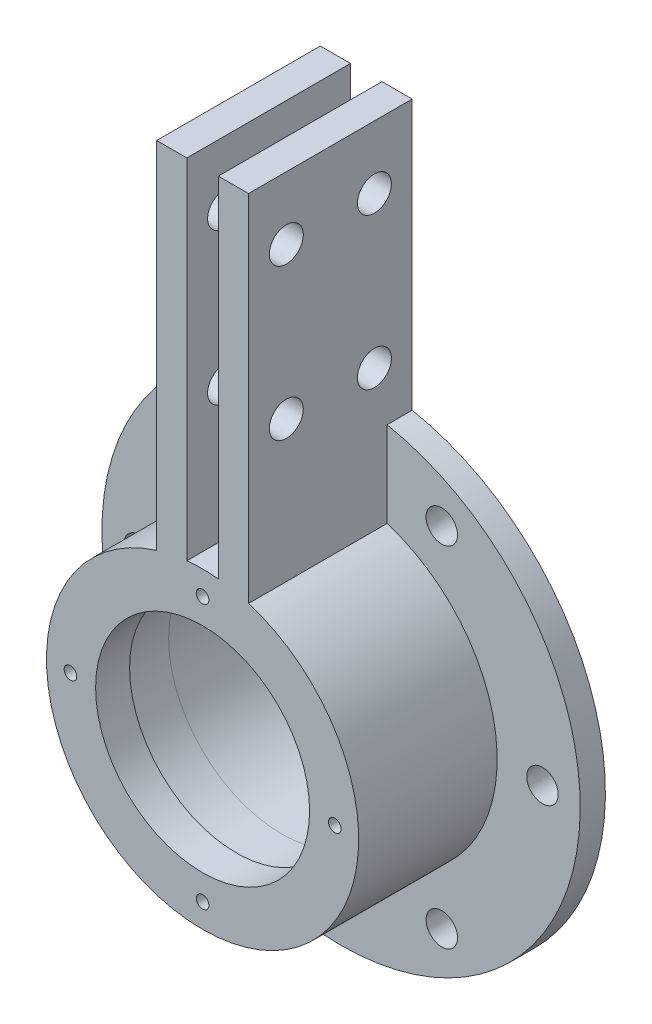
ISO-10303-21;
HEADER;
FILE_DESCRIPTION(('STEP AP214'),'2;1');
FILE_NAME('part.step','',(''),(''),'','','');
FILE_SCHEMA(('AUTOMOTIVE_DESIGN { 1 0 10303 214 1 1 1 1 }'));
ENDSEC;
DATA;
#1=APPLICATION_CONTEXT('core data for automotive mechanical design processes');
#2=APPLICATION_PROTOCOL_DEFINITION('international standard','automotive_design',2000,#1);
#3=PRODUCT_CONTEXT('',#1,'mechanical');
#4=PRODUCT('Part','Part','',(#3));
#5=PRODUCT_RELATED_PRODUCT_CATEGORY('part','',(#4));
#6=PRODUCT_DEFINITION_FORMATION('','',#4);
#7=PRODUCT_DEFINITION_CONTEXT('part definition',#1,'design');
#8=PRODUCT_DEFINITION('design','',#6,#7);
#9=PRODUCT_DEFINITION_SHAPE('','',#8);
#10=(LENGTH_UNIT() NAMED_UNIT(*) SI_UNIT(.MILLI.,.METRE.));
#11=(NAMED_UNIT(*) PLANE_ANGLE_UNIT() SI_UNIT($,.RADIAN.));
#12=(NAMED_UNIT(*) SI_UNIT($,.STERADIAN.) SOLID_ANGLE_UNIT());
#13=UNCERTAINTY_MEASURE_WITH_UNIT(LENGTH_MEASURE(1.E-05),#10,'distance_accuracy_value','');
#14=(GEOMETRIC_REPRESENTATION_CONTEXT(3) GLOBAL_UNCERTAINTY_ASSIGNED_CONTEXT((#13)) GLOBAL_UNIT_ASSIGNED_CONTEXT((#10,
#11,#12)) REPRESENTATION_CONTEXT('',''));
#15=CARTESIAN_POINT('',(0.,0.,0.));
#16=DIRECTION('',(0.,0.,1.));
#17=DIRECTION('',(1.,0.,0.));
#18=AXIS2_PLACEMENT_3D('',#15,#16,#17);
#19=CARTESIAN_POINT('',(0.,0.,0.));
#20=DIRECTION('',(0.,0.,1.));
#21=DIRECTION('',(1.,0.,0.));
#22=AXIS2_PLACEMENT_3D('',#19,#20,#21);
#23=PLANE('',#22);
#24=CARTESIAN_POINT('',(39.9999999999998,69.2820323027552,0.));
#25=DIRECTION('',(0.,0.,-1.));
#26=DIRECTION('',(-1.,0.,0.));
#27=AXIS2_PLACEMENT_3D('',#24,#25,#26);
#28=CIRCLE('',#27,6.24999999999999);
#29=CARTESIAN_POINT('',(33.7499999999999,69.2820323027552,0.));
#30=VERTEX_POINT('',#29);
#31=EDGE_CURVE('E185',#30,#30,#28,.T.);
#32=ORIENTED_EDGE('',*,*,#31,.F.);
#33=EDGE_LOOP('',(#32));
#34=FACE_BOUND('',#33,.T.);
#35=CARTESIAN_POINT('',(-39.9999999999994,-69.2820323027554,0.));
#36=DIRECTION('',(0.,0.,-1.));
#37=DIRECTION('',(-1.,0.,0.));
#38=AXIS2_PLACEMENT_3D('',#35,#36,#37);
#39=CIRCLE('',#38,6.24999999999999);
#40=CARTESIAN_POINT('',(-46.2499999999993,-69.2820323027554,0.));
#41=VERTEX_POINT('',#40);
#42=EDGE_CURVE('E209',#41,#41,#39,.T.);
#43=ORIENTED_EDGE('',*,*,#42,.F.);
#44=EDGE_LOOP('',(#43));
#45=FACE_BOUND('',#44,.T.);
#46=DIRECTION('',(-1.,0.,0.));
#47=VECTOR('',#46,1.);
#48=CARTESIAN_POINT('',(-18.25,200.253164472457,0.));
#49=LINE('',#48,#47);
#50=CARTESIAN_POINT('',(-6.25,200.253164472457,0.));
#51=VERTEX_POINT('',#50);
#52=CARTESIAN_POINT('',(-18.25,200.253164472457,0.));
#53=VERTEX_POINT('',#52);
#54=EDGE_CURVE('E297',#51,#53,#49,.T.);
#55=ORIENTED_EDGE('',*,*,#54,.F.);
#56=DIRECTION('',(0.,1.,0.));
#57=VECTOR('',#56,1.);
#58=CARTESIAN_POINT('',(-6.25,200.253164472457,0.));
#59=LINE('',#58,#57);
#60=CARTESIAN_POINT('',(-6.24999999999999,61.6841754423288,0.));
#61=VERTEX_POINT('',#60);
#62=EDGE_CURVE('E267',#61,#51,#59,.T.);
#63=ORIENTED_EDGE('',*,*,#62,.F.);
#64=CARTESIAN_POINT('',(0.,0.,0.));
#65=DIRECTION('',(0.,0.,1.));
#66=DIRECTION('',(1.,0.,0.));
#67=AXIS2_PLACEMENT_3D('',#64,#65,#66);
#68=CIRCLE('',#67,62.);
#69=CARTESIAN_POINT('',(6.25000000000002,61.6841754423288,0.));
#70=VERTEX_POINT('',#69);
#71=EDGE_CURVE('E273',#70,#61,#68,.T.);
#72=ORIENTED_EDGE('',*,*,#71,.F.);
#73=DIRECTION('',(0.,-1.,0.));
#74=VECTOR('',#73,1.);
#75=CARTESIAN_POINT('',(6.25,200.253164472457,0.));
#76=LINE('',#75,#74);
#77=CARTESIAN_POINT('',(6.25,200.253164472457,0.));
#78=VERTEX_POINT('',#77);
#79=EDGE_CURVE('E308',#78,#70,#76,.T.);
#80=ORIENTED_EDGE('',*,*,#79,.F.);
#81=DIRECTION('',(-1.,0.,0.));
#82=VECTOR('',#81,1.);
#83=CARTESIAN_POINT('',(6.25,200.253164472457,0.));
#84=LINE('',#83,#82);
#85=CARTESIAN_POINT('',(18.25,200.253164472457,0.));
#86=VERTEX_POINT('',#85);
#87=EDGE_CURVE('E305',#86,#78,#84,.T.);
#88=ORIENTED_EDGE('',*,*,#87,.F.);
#89=DIRECTION('',(0.,1.,0.));
#90=VECTOR('',#89,1.);
#91=CARTESIAN_POINT('',(18.25,59.2531644724567,0.));
#92=LINE('',#91,#90);
#93=CARTESIAN_POINT('',(18.25,93.2305609765382,0.));
#94=VERTEX_POINT('',#93);
#95=EDGE_CURVE('E302',#94,#86,#92,.T.);
#96=ORIENTED_EDGE('',*,*,#95,.F.);
#97=CARTESIAN_POINT('',(0.,0.,0.));
#98=DIRECTION('',(0.,0.,-1.));
#99=DIRECTION('',(-1.,0.,0.));
#100=AXIS2_PLACEMENT_3D('',#97,#98,#99);
#101=CIRCLE('',#100,95.);
#102=CARTESIAN_POINT('',(-18.25,93.2305609765382,0.));
#103=VERTEX_POINT('',#102);
#104=EDGE_CURVE('E238',#94,#103,#101,.T.);
#105=ORIENTED_EDGE('',*,*,#104,.T.);
#106=DIRECTION('',(0.,-1.,0.));
#107=VECTOR('',#106,1.);
#108=CARTESIAN_POINT('',(-18.25,59.2531644724567,0.));
#109=LINE('',#108,#107);
#110=EDGE_CURVE('E68',#53,#103,#109,.T.);
#111=ORIENTED_EDGE('',*,*,#110,.F.);
#112=EDGE_LOOP('',(#55,#63,#72,#80,#88,#96,#105,#111));
#113=FACE_BOUND('',#112,.T.);
#114=CARTESIAN_POINT('',(40.0000000000008,-69.2820323027546,0.));
#115=DIRECTION('',(0.,0.,-1.));
#116=DIRECTION('',(-1.,0.,0.));
#117=AXIS2_PLACEMENT_3D('',#114,#115,#116);
#118=CIRCLE('',#117,6.24999999999998);
#119=CARTESIAN_POINT('',(33.7500000000008,-69.2820323027546,0.));
#120=VERTEX_POINT('',#119);
#121=EDGE_CURVE('E217',#120,#120,#118,.T.);
#122=ORIENTED_EDGE('',*,*,#121,.F.);
#123=EDGE_LOOP('',(#122));
#124=FACE_BOUND('',#123,.T.);
#125=CARTESIAN_POINT('',(-80.,-5.58637014214901E-13,0.));
#126=DIRECTION('',(0.,0.,-1.));
#127=DIRECTION('',(-1.,0.,0.));
#128=AXIS2_PLACEMENT_3D('',#125,#126,#127);
#129=CIRCLE('',#128,6.24999999999999);
#130=CARTESIAN_POINT('',(-86.25,-5.58637014214901E-13,0.));
#131=VERTEX_POINT('',#130);
#132=EDGE_CURVE('E201',#131,#131,#129,.T.);
#133=ORIENTED_EDGE('',*,*,#132,.F.);
#134=EDGE_LOOP('',(#133));
#135=FACE_BOUND('',#134,.T.);
#136=CARTESIAN_POINT('',(-40.0000000000003,69.2820323027549,0.));
#137=DIRECTION('',(0.,0.,-1.));
#138=DIRECTION('',(-1.,0.,0.));
#139=AXIS2_PLACEMENT_3D('',#136,#137,#138);
#140=CIRCLE('',#139,6.24999999999998);
#141=CARTESIAN_POINT('',(-46.2500000000003,69.2820323027549,0.));
#142=VERTEX_POINT('',#141);
#143=EDGE_CURVE('E193',#142,#142,#140,.T.);
#144=ORIENTED_EDGE('',*,*,#143,.F.);
#145=EDGE_LOOP('',(#144));
#146=FACE_BOUND('',#145,.T.);
#147=CARTESIAN_POINT('',(80.,0.,0.));
#148=DIRECTION('',(0.,0.,-1.));
#149=DIRECTION('',(-1.,0.,0.));
#150=AXIS2_PLACEMENT_3D('',#147,#148,#149);
#151=CIRCLE('',#150,6.24999999999999);
#152=CARTESIAN_POINT('',(73.75,0.,0.));
#153=VERTEX_POINT('',#152);
#154=EDGE_CURVE('E177',#153,#153,#151,.T.);
#155=ORIENTED_EDGE('',*,*,#154,.F.);
#156=EDGE_LOOP('',(#155));
#157=FACE_BOUND('',#156,.T.);
#158=CARTESIAN_POINT('',(0.,0.,0.));
#159=DIRECTION('',(0.,0.,1.));
#160=DIRECTION('',(1.,0.,0.));
#161=AXIS2_PLACEMENT_3D('',#158,#159,#160);
#162=CIRCLE('',#161,52.5);
#163=CARTESIAN_POINT('',(52.5,0.,0.));
#164=VERTEX_POINT('',#163);
#165=EDGE_CURVE('E11',#164,#164,#162,.F.);
#166=ORIENTED_EDGE('',*,*,#165,.F.);
#167=EDGE_LOOP('',(#166));
#168=FACE_BOUND('',#167,.T.);
#169=ADVANCED_FACE('F45',(#34,#45,#113,#124,#135,#146,#157,#168),#23,.F.);
#170=CARTESIAN_POINT('',(0.,0.,65.));
#171=DIRECTION('',(0.,0.,-1.));
#172=DIRECTION('',(-1.,0.,0.));
#173=AXIS2_PLACEMENT_3D('',#170,#171,#172);
#174=CYLINDRICAL_SURFACE('',#173,42.5);
#175=CARTESIAN_POINT('',(0.,0.,65.));
#176=DIRECTION('',(0.,0.,1.));
#177=DIRECTION('',(1.,0.,0.));
#178=AXIS2_PLACEMENT_3D('',#175,#176,#177);
#179=CIRCLE('',#178,42.5);
#180=CARTESIAN_POINT('',(42.5,0.,65.));
#181=VERTEX_POINT('',#180);
#182=EDGE_CURVE('E263',#181,#181,#179,.T.);
#183=ORIENTED_EDGE('',*,*,#182,.T.);
#184=EDGE_LOOP('',(#183));
#185=FACE_BOUND('',#184,.T.);
#186=CARTESIAN_POINT('',(0.,0.,51.5));
#187=DIRECTION('',(0.,0.,-1.));
#188=DIRECTION('',(-1.,0.,0.));
#189=AXIS2_PLACEMENT_3D('',#186,#187,#188);
#190=CIRCLE('',#189,42.5);
#191=CARTESIAN_POINT('',(-42.5,0.,51.5));
#192=VERTEX_POINT('',#191);
#193=EDGE_CURVE('E230',#192,#192,#190,.T.);
#194=ORIENTED_EDGE('',*,*,#193,.T.);
#195=EDGE_LOOP('',(#194));
#196=FACE_BOUND('',#195,.T.);
#197=ADVANCED_FACE('F420',(#185,#196),#174,.F.);
#198=CARTESIAN_POINT('',(0.,0.,65.));
#199=DIRECTION('',(0.,0.,-1.));
#200=DIRECTION('',(-1.,0.,0.));
#201=AXIS2_PLACEMENT_3D('',#198,#199,#200);
#202=CYLINDRICAL_SURFACE('',#201,62.);
#203=CARTESIAN_POINT('',(0.,0.,10.));
#204=DIRECTION('',(0.,0.,-1.));
#205=DIRECTION('',(-1.,0.,0.));
#206=AXIS2_PLACEMENT_3D('',#203,#204,#205);
#207=CIRCLE('',#206,62.);
#208=CARTESIAN_POINT('',(18.25,59.2531644724567,10.));
#209=VERTEX_POINT('',#208);
#210=CARTESIAN_POINT('',(-18.25,59.2531644724567,10.));
#211=VERTEX_POINT('',#210);
#212=EDGE_CURVE('E250',#209,#211,#207,.T.);
#213=ORIENTED_EDGE('',*,*,#212,.F.);
#214=DIRECTION('',(0.,0.,-1.));
#215=VECTOR('',#214,1.);
#216=CARTESIAN_POINT('',(18.25,59.2531644724567,65.));
#217=LINE('',#216,#215);
#218=CARTESIAN_POINT('',(18.25,59.2531644724567,65.));
#219=VERTEX_POINT('',#218);
#220=EDGE_CURVE('E328',#219,#209,#217,.T.);
#221=ORIENTED_EDGE('',*,*,#220,.F.);
#222=CARTESIAN_POINT('',(0.,0.,65.));
#223=DIRECTION('',(0.,0.,1.));
#224=DIRECTION('',(1.,0.,0.));
#225=AXIS2_PLACEMENT_3D('',#222,#223,#224);
#226=CIRCLE('',#225,62.);
#227=CARTESIAN_POINT('',(-18.25,59.2531644724567,65.));
#228=VERTEX_POINT('',#227);
#229=EDGE_CURVE('E279',#228,#219,#226,.T.);
#230=ORIENTED_EDGE('',*,*,#229,.F.);
#231=DIRECTION('',(0.,0.,-1.));
#232=VECTOR('',#231,1.);
#233=CARTESIAN_POINT('',(-18.25,59.2531644724567,65.));
#234=LINE('',#233,#232);
#235=EDGE_CURVE('E332',#228,#211,#234,.T.);
#236=ORIENTED_EDGE('',*,*,#235,.T.);
#237=EDGE_LOOP('',(#213,#221,#230,#236));
#238=FACE_BOUND('',#237,.T.);
#239=ADVANCED_FACE('F426',(#238),#202,.T.);
#240=CARTESIAN_POINT('',(0.,0.,65.));
#241=DIRECTION('',(0.,0.,1.));
#242=DIRECTION('',(1.,0.,0.));
#243=AXIS2_PLACEMENT_3D('',#240,#241,#242);
#244=PLANE('',#243);
#245=CARTESIAN_POINT('',(-52.5,0.,65.));
#246=DIRECTION('',(0.,0.,1.));
#247=DIRECTION('',(1.,0.,0.));
#248=AXIS2_PLACEMENT_3D('',#245,#246,#247);
#249=CIRCLE('',#248,2.49999999999999);
#250=CARTESIAN_POINT('',(-50.,0.,65.));
#251=VERTEX_POINT('',#250);
#252=EDGE_CURVE('E146',#251,#251,#249,.T.);
#253=ORIENTED_EDGE('',*,*,#252,.F.);
#254=EDGE_LOOP('',(#253));
#255=FACE_BOUND('',#254,.T.);
#256=CARTESIAN_POINT('',(0.,52.5,65.));
#257=DIRECTION('',(0.,0.,1.));
#258=DIRECTION('',(1.,0.,0.));
#259=AXIS2_PLACEMENT_3D('',#256,#257,#258);
#260=CIRCLE('',#259,2.49999999999999);
#261=CARTESIAN_POINT('',(2.49999999999999,52.5,65.));
#262=VERTEX_POINT('',#261);
#263=EDGE_CURVE('E145',#262,#262,#260,.T.);
#264=ORIENTED_EDGE('',*,*,#263,.F.);
#265=EDGE_LOOP('',(#264));
#266=FACE_BOUND('',#265,.T.);
#267=CARTESIAN_POINT('',(52.5,0.,65.));
#268=DIRECTION('',(0.,0.,1.));
#269=DIRECTION('',(1.,0.,0.));
#270=AXIS2_PLACEMENT_3D('',#267,#268,#269);
#271=CIRCLE('',#270,2.49999999999999);
#272=CARTESIAN_POINT('',(55.,0.,65.));
#273=VERTEX_POINT('',#272);
#274=EDGE_CURVE('E161',#273,#273,#271,.T.);
#275=ORIENTED_EDGE('',*,*,#274,.F.);
#276=EDGE_LOOP('',(#275));
#277=FACE_BOUND('',#276,.T.);
#278=CARTESIAN_POINT('',(0.,-52.5,65.));
#279=DIRECTION('',(0.,0.,1.));
#280=DIRECTION('',(1.,0.,0.));
#281=AXIS2_PLACEMENT_3D('',#278,#279,#280);
#282=CIRCLE('',#281,2.49999999999999);
#283=CARTESIAN_POINT('',(2.49999999999999,-52.5,65.));
#284=VERTEX_POINT('',#283);
#285=EDGE_CURVE('E169',#284,#284,#282,.T.);
#286=ORIENTED_EDGE('',*,*,#285,.F.);
#287=EDGE_LOOP('',(#286));
#288=FACE_BOUND('',#287,.T.);
#289=DIRECTION('',(0.,1.,0.));
#290=VECTOR('',#289,1.);
#291=CARTESIAN_POINT('',(-6.25,200.253164472457,65.));
#292=LINE('',#291,#290);
#293=CARTESIAN_POINT('',(-6.24999999999999,61.6841754423288,65.));
#294=VERTEX_POINT('',#293);
#295=CARTESIAN_POINT('',(-6.25,200.253164472457,65.));
#296=VERTEX_POINT('',#295);
#297=EDGE_CURVE('E268',#294,#296,#292,.T.);
#298=ORIENTED_EDGE('',*,*,#297,.T.);
#299=DIRECTION('',(-1.,0.,0.));
#300=VECTOR('',#299,1.);
#301=CARTESIAN_POINT('',(-18.25,200.253164472457,65.));
#302=LINE('',#301,#300);
#303=CARTESIAN_POINT('',(-18.25,200.253164472457,65.));
#304=VERTEX_POINT('',#303);
#305=EDGE_CURVE('E272',#296,#304,#302,.T.);
#306=ORIENTED_EDGE('',*,*,#305,.T.);
#307=DIRECTION('',(0.,-1.,0.));
#308=VECTOR('',#307,1.);
#309=CARTESIAN_POINT('',(-18.25,59.2531644724567,65.));
#310=LINE('',#309,#308);
#311=EDGE_CURVE('E276',#304,#228,#310,.T.);
#312=ORIENTED_EDGE('',*,*,#311,.T.);
#313=ORIENTED_EDGE('',*,*,#229,.T.);
#314=DIRECTION('',(0.,1.,0.));
#315=VECTOR('',#314,1.);
#316=CARTESIAN_POINT('',(18.25,59.2531644724567,65.));
#317=LINE('',#316,#315);
#318=CARTESIAN_POINT('',(18.25,200.253164472457,65.));
#319=VERTEX_POINT('',#318);
#320=EDGE_CURVE('E282',#219,#319,#317,.T.);
#321=ORIENTED_EDGE('',*,*,#320,.T.);
#322=DIRECTION('',(-1.,0.,0.));
#323=VECTOR('',#322,1.);
#324=CARTESIAN_POINT('',(6.25,200.253164472457,65.));
#325=LINE('',#324,#323);
#326=CARTESIAN_POINT('',(6.25,200.253164472457,65.));
#327=VERTEX_POINT('',#326);
#328=EDGE_CURVE('E285',#319,#327,#325,.T.);
#329=ORIENTED_EDGE('',*,*,#328,.T.);
#330=DIRECTION('',(0.,-1.,0.));
#331=VECTOR('',#330,1.);
#332=CARTESIAN_POINT('',(6.25,200.253164472457,65.));
#333=LINE('',#332,#331);
#334=CARTESIAN_POINT('',(6.25000000000002,61.6841754423288,65.));
#335=VERTEX_POINT('',#334);
#336=EDGE_CURVE('E288',#327,#335,#333,.T.);
#337=ORIENTED_EDGE('',*,*,#336,.T.);
#338=CARTESIAN_POINT('',(0.,0.,65.));
#339=DIRECTION('',(0.,0.,1.));
#340=DIRECTION('',(1.,0.,0.));
#341=AXIS2_PLACEMENT_3D('',#338,#339,#340);
#342=CIRCLE('',#341,62.);
#343=EDGE_CURVE('E291',#335,#294,#342,.T.);
#344=ORIENTED_EDGE('',*,*,#343,.T.);
#345=EDGE_LOOP('',(#298,#306,#312,#313,#321,#329,#337,#344));
#346=FACE_BOUND('',#345,.T.);
#347=ORIENTED_EDGE('',*,*,#182,.F.);
#348=EDGE_LOOP('',(#347));
#349=FACE_BOUND('',#348,.T.);
#350=ADVANCED_FACE('F433',(#255,#266,#277,#288,#346,#349),#244,.T.);
#351=CARTESIAN_POINT('',(-6.25,200.253164472457,65.));
#352=DIRECTION('',(-1.,0.,0.));
#353=DIRECTION('',(0.,-1.,0.));
#354=AXIS2_PLACEMENT_3D('',#351,#352,#353);
#355=PLANE('',#354);
#356=CARTESIAN_POINT('',(-6.25,175.253164472457,15.));
#357=DIRECTION('',(-1.,0.,0.));
#358=DIRECTION('',(0.,-1.,0.));
#359=AXIS2_PLACEMENT_3D('',#356,#357,#358);
#360=CIRCLE('',#359,6.74999999999998);
#361=CARTESIAN_POINT('',(-6.24999999999999,168.503164472457,15.));
#362=VERTEX_POINT('',#361);
#363=EDGE_CURVE('E369',#362,#362,#360,.T.);
#364=ORIENTED_EDGE('',*,*,#363,.T.);
#365=EDGE_LOOP('',(#364));
#366=FACE_BOUND('',#365,.T.);
#367=CARTESIAN_POINT('',(-6.25,175.253164472457,50.));
#368=DIRECTION('',(-1.,0.,0.));
#369=DIRECTION('',(0.,-1.,0.));
#370=AXIS2_PLACEMENT_3D('',#367,#368,#369);
#371=CIRCLE('',#370,6.74999999999998);
#372=CARTESIAN_POINT('',(-6.24999999999999,168.503164472457,50.));
#373=VERTEX_POINT('',#372);
#374=EDGE_CURVE('E366',#373,#373,#371,.T.);
#375=ORIENTED_EDGE('',*,*,#374,.T.);
#376=EDGE_LOOP('',(#375));
#377=FACE_BOUND('',#376,.T.);
#378=CARTESIAN_POINT('',(-6.24999999999999,115.253164472457,50.));
#379=DIRECTION('',(-1.,0.,0.));
#380=DIRECTION('',(0.,-1.,0.));
#381=AXIS2_PLACEMENT_3D('',#378,#379,#380);
#382=CIRCLE('',#381,6.74999999999998);
#383=CARTESIAN_POINT('',(-6.24999999999999,108.503164472457,50.));
#384=VERTEX_POINT('',#383);
#385=EDGE_CURVE('E388',#384,#384,#382,.T.);
#386=ORIENTED_EDGE('',*,*,#385,.T.);
#387=EDGE_LOOP('',(#386));
#388=FACE_BOUND('',#387,.T.);
#389=CARTESIAN_POINT('',(-6.24999999999999,115.253164472457,15.));
#390=DIRECTION('',(-1.,0.,0.));
#391=DIRECTION('',(0.,-1.,0.));
#392=AXIS2_PLACEMENT_3D('',#389,#390,#391);
#393=CIRCLE('',#392,6.74999999999998);
#394=CARTESIAN_POINT('',(-6.24999999999999,108.503164472457,15.));
#395=VERTEX_POINT('',#394);
#396=EDGE_CURVE('E398',#395,#395,#393,.T.);
#397=ORIENTED_EDGE('',*,*,#396,.T.);
#398=EDGE_LOOP('',(#397));
#399=FACE_BOUND('',#398,.T.);
#400=ORIENTED_EDGE('',*,*,#62,.T.);
#401=DIRECTION('',(0.,0.,-1.));
#402=VECTOR('',#401,1.);
#403=CARTESIAN_POINT('',(-6.25,200.253164472457,65.));
#404=LINE('',#403,#402);
#405=EDGE_CURVE('E55',#296,#51,#404,.T.);
#406=ORIENTED_EDGE('',*,*,#405,.F.);
#407=ORIENTED_EDGE('',*,*,#297,.F.);
#408=DIRECTION('',(0.,0.,-1.));
#409=VECTOR('',#408,1.);
#410=CARTESIAN_POINT('',(-6.24999999999999,61.6841754423288,65.));
#411=LINE('',#410,#409);
#412=EDGE_CURVE('E294',#294,#61,#411,.T.);
#413=ORIENTED_EDGE('',*,*,#412,.T.);
#414=EDGE_LOOP('',(#400,#406,#407,#413));
#415=FACE_BOUND('',#414,.T.);
#416=ADVANCED_FACE('F47',(#366,#377,#388,#399,#415),#355,.F.);
#417=CARTESIAN_POINT('',(-18.25,200.253164472457,65.));
#418=DIRECTION('',(0.,-1.,0.));
#419=DIRECTION('',(0.,0.,-1.));
#420=AXIS2_PLACEMENT_3D('',#417,#418,#419);
#421=PLANE('',#420);
#422=ORIENTED_EDGE('',*,*,#54,.T.);
#423=DIRECTION('',(0.,0.,-1.));
#424=VECTOR('',#423,1.);
#425=CARTESIAN_POINT('',(-18.25,200.253164472457,65.));
#426=LINE('',#425,#424);
#427=EDGE_CURVE('E336',#304,#53,#426,.T.);
#428=ORIENTED_EDGE('',*,*,#427,.F.);
#429=ORIENTED_EDGE('',*,*,#305,.F.);
#430=ORIENTED_EDGE('',*,*,#405,.T.);
#431=EDGE_LOOP('',(#422,#428,#429,#430));
#432=FACE_BOUND('',#431,.T.);
#433=ADVANCED_FACE('F456',(#432),#421,.F.);
#434=CARTESIAN_POINT('',(-18.25,59.2531644724567,65.));
#435=DIRECTION('',(1.,0.,0.));
#436=DIRECTION('',(0.,0.,-1.));
#437=AXIS2_PLACEMENT_3D('',#434,#435,#436);
#438=PLANE('',#437);
#439=CARTESIAN_POINT('',(-18.25,175.253164472457,15.));
#440=DIRECTION('',(-1.,0.,0.));
#441=DIRECTION('',(0.,0.,1.));
#442=AXIS2_PLACEMENT_3D('',#439,#440,#441);
#443=CIRCLE('',#442,6.74999999999998);
#444=CARTESIAN_POINT('',(-18.25,175.253164472457,21.75));
#445=VERTEX_POINT('',#444);
#446=EDGE_CURVE('E794',#445,#445,#443,.T.);
#447=ORIENTED_EDGE('',*,*,#446,.F.);
#448=EDGE_LOOP('',(#447));
#449=FACE_BOUND('',#448,.T.);
#450=CARTESIAN_POINT('',(-18.25,175.253164472457,50.));
#451=DIRECTION('',(-1.,0.,0.));
#452=DIRECTION('',(0.,0.,1.));
#453=AXIS2_PLACEMENT_3D('',#450,#451,#452);
#454=CIRCLE('',#453,6.74999999999998);
#455=CARTESIAN_POINT('',(-18.25,175.253164472457,56.75));
#456=VERTEX_POINT('',#455);
#457=EDGE_CURVE('E360',#456,#456,#454,.T.);
#458=ORIENTED_EDGE('',*,*,#457,.F.);
#459=EDGE_LOOP('',(#458));
#460=FACE_BOUND('',#459,.T.);
#461=CARTESIAN_POINT('',(-18.25,115.253164472457,50.));
#462=DIRECTION('',(-1.,0.,0.));
#463=DIRECTION('',(0.,0.,1.));
#464=AXIS2_PLACEMENT_3D('',#461,#462,#463);
#465=CIRCLE('',#464,6.74999999999999);
#466=CARTESIAN_POINT('',(-18.25,115.253164472457,56.75));
#467=VERTEX_POINT('',#466);
#468=EDGE_CURVE('E355',#467,#467,#465,.T.);
#469=ORIENTED_EDGE('',*,*,#468,.F.);
#470=EDGE_LOOP('',(#469));
#471=FACE_BOUND('',#470,.T.);
#472=CARTESIAN_POINT('',(-18.25,115.253164472457,15.));
#473=DIRECTION('',(-1.,0.,0.));
#474=DIRECTION('',(0.,0.,1.));
#475=AXIS2_PLACEMENT_3D('',#472,#473,#474);
#476=CIRCLE('',#475,6.74999999999999);
#477=CARTESIAN_POINT('',(-18.25,115.253164472457,21.75));
#478=VERTEX_POINT('',#477);
#479=EDGE_CURVE('E350',#478,#478,#476,.T.);
#480=ORIENTED_EDGE('',*,*,#479,.F.);
#481=EDGE_LOOP('',(#480));
#482=FACE_BOUND('',#481,.T.);
#483=ORIENTED_EDGE('',*,*,#110,.T.);
#484=DIRECTION('',(0.,0.,-1.));
#485=VECTOR('',#484,1.);
#486=CARTESIAN_POINT('',(-18.25,93.2305609765382,10.));
#487=LINE('',#486,#485);
#488=CARTESIAN_POINT('',(-18.25,93.2305609765382,10.));
#489=VERTEX_POINT('',#488);
#490=EDGE_CURVE('E63',#103,#489,#487,.F.);
#491=ORIENTED_EDGE('',*,*,#490,.T.);
#492=DIRECTION('',(0.,1.,0.));
#493=VECTOR('',#492,1.);
#494=CARTESIAN_POINT('',(-18.25,59.2531644724567,10.));
#495=LINE('',#494,#493);
#496=EDGE_CURVE('E254',#211,#489,#495,.T.);
#497=ORIENTED_EDGE('',*,*,#496,.F.);
#498=ORIENTED_EDGE('',*,*,#235,.F.);
#499=ORIENTED_EDGE('',*,*,#311,.F.);
#500=ORIENTED_EDGE('',*,*,#427,.T.);
#501=EDGE_LOOP('',(#483,#491,#497,#498,#499,#500));
#502=FACE_BOUND('',#501,.T.);
#503=ADVANCED_FACE('F450',(#449,#460,#471,#482,#502),#438,.F.);
#504=CARTESIAN_POINT('',(18.25,59.2531644724567,65.));
#505=DIRECTION('',(-1.,0.,0.));
#506=DIRECTION('',(0.,0.,1.));
#507=AXIS2_PLACEMENT_3D('',#504,#505,#506);
#508=PLANE('',#507);
#509=CARTESIAN_POINT('',(18.25,175.253164472457,15.));
#510=DIRECTION('',(-1.,0.,0.));
#511=DIRECTION('',(0.,0.,1.));
#512=AXIS2_PLACEMENT_3D('',#509,#510,#511);
#513=CIRCLE('',#512,6.74999999999998);
#514=CARTESIAN_POINT('',(18.25,175.253164472457,21.75));
#515=VERTEX_POINT('',#514);
#516=EDGE_CURVE('E375',#515,#515,#513,.T.);
#517=ORIENTED_EDGE('',*,*,#516,.T.);
#518=EDGE_LOOP('',(#517));
#519=FACE_BOUND('',#518,.T.);
#520=CARTESIAN_POINT('',(18.25,175.253164472457,50.));
#521=DIRECTION('',(-1.,0.,0.));
#522=DIRECTION('',(0.,0.,1.));
#523=AXIS2_PLACEMENT_3D('',#520,#521,#522);
#524=CIRCLE('',#523,6.74999999999998);
#525=CARTESIAN_POINT('',(18.25,175.253164472457,56.75));
#526=VERTEX_POINT('',#525);
#527=EDGE_CURVE('E359',#526,#526,#524,.T.);
#528=ORIENTED_EDGE('',*,*,#527,.T.);
#529=EDGE_LOOP('',(#528));
#530=FACE_BOUND('',#529,.T.);
#531=CARTESIAN_POINT('',(18.25,115.253164472457,50.));
#532=DIRECTION('',(-1.,0.,0.));
#533=DIRECTION('',(0.,0.,1.));
#534=AXIS2_PLACEMENT_3D('',#531,#532,#533);
#535=CIRCLE('',#534,6.74999999999998);
#536=CARTESIAN_POINT('',(18.25,115.253164472457,56.75));
#537=VERTEX_POINT('',#536);
#538=EDGE_CURVE('E354',#537,#537,#535,.T.);
#539=ORIENTED_EDGE('',*,*,#538,.T.);
#540=EDGE_LOOP('',(#539));
#541=FACE_BOUND('',#540,.T.);
#542=CARTESIAN_POINT('',(18.25,115.253164472457,15.));
#543=DIRECTION('',(-1.,0.,0.));
#544=DIRECTION('',(0.,0.,1.));
#545=AXIS2_PLACEMENT_3D('',#542,#543,#544);
#546=CIRCLE('',#545,6.74999999999998);
#547=CARTESIAN_POINT('',(18.25,115.253164472457,21.75));
#548=VERTEX_POINT('',#547);
#549=EDGE_CURVE('E349',#548,#548,#546,.T.);
#550=ORIENTED_EDGE('',*,*,#549,.T.);
#551=EDGE_LOOP('',(#550));
#552=FACE_BOUND('',#551,.T.);
#553=DIRECTION('',(0.,-1.,0.));
#554=VECTOR('',#553,1.);
#555=CARTESIAN_POINT('',(18.25,59.2531644724567,10.));
#556=LINE('',#555,#554);
#557=CARTESIAN_POINT('',(18.25,93.2305609765382,10.));
#558=VERTEX_POINT('',#557);
#559=EDGE_CURVE('E243',#558,#209,#556,.T.);
#560=ORIENTED_EDGE('',*,*,#559,.F.);
#561=DIRECTION('',(0.,0.,-1.));
#562=VECTOR('',#561,1.);
#563=CARTESIAN_POINT('',(18.25,93.2305609765382,10.));
#564=LINE('',#563,#562);
#565=EDGE_CURVE('E257',#558,#94,#564,.T.);
#566=ORIENTED_EDGE('',*,*,#565,.T.);
#567=ORIENTED_EDGE('',*,*,#95,.T.);
#568=DIRECTION('',(0.,0.,-1.));
#569=VECTOR('',#568,1.);
#570=CARTESIAN_POINT('',(18.25,200.253164472457,65.));
#571=LINE('',#570,#569);
#572=EDGE_CURVE('E324',#319,#86,#571,.T.);
#573=ORIENTED_EDGE('',*,*,#572,.F.);
#574=ORIENTED_EDGE('',*,*,#320,.F.);
#575=ORIENTED_EDGE('',*,*,#220,.T.);
#576=EDGE_LOOP('',(#560,#566,#567,#573,#574,#575));
#577=FACE_BOUND('',#576,.T.);
#578=ADVANCED_FACE('F446',(#519,#530,#541,#552,#577),#508,.F.);
#579=CARTESIAN_POINT('',(6.25,200.253164472457,65.));
#580=DIRECTION('',(0.,-1.,0.));
#581=DIRECTION('',(0.,0.,-1.));
#582=AXIS2_PLACEMENT_3D('',#579,#580,#581);
#583=PLANE('',#582);
#584=ORIENTED_EDGE('',*,*,#87,.T.);
#585=DIRECTION('',(0.,0.,-1.));
#586=VECTOR('',#585,1.);
#587=CARTESIAN_POINT('',(6.25,200.253164472457,65.));
#588=LINE('',#587,#586);
#589=EDGE_CURVE('E320',#327,#78,#588,.T.);
#590=ORIENTED_EDGE('',*,*,#589,.F.);
#591=ORIENTED_EDGE('',*,*,#328,.F.);
#592=ORIENTED_EDGE('',*,*,#572,.T.);
#593=EDGE_LOOP('',(#584,#590,#591,#592));
#594=FACE_BOUND('',#593,.T.);
#595=ADVANCED_FACE('F442',(#594),#583,.F.);
#596=CARTESIAN_POINT('',(6.25,200.253164472457,65.));
#597=DIRECTION('',(1.,0.,0.));
#598=DIRECTION('',(0.,1.,0.));
#599=AXIS2_PLACEMENT_3D('',#596,#597,#598);
#600=PLANE('',#599);
#601=CARTESIAN_POINT('',(6.25,175.253164472457,15.));
#602=DIRECTION('',(1.,0.,0.));
#603=DIRECTION('',(0.,1.,0.));
#604=AXIS2_PLACEMENT_3D('',#601,#602,#603);
#605=CIRCLE('',#604,6.74999999999998);
#606=CARTESIAN_POINT('',(6.25,182.003164472457,15.));
#607=VERTEX_POINT('',#606);
#608=EDGE_CURVE('E49',#607,#607,#605,.T.);
#609=ORIENTED_EDGE('',*,*,#608,.T.);
#610=EDGE_LOOP('',(#609));
#611=FACE_BOUND('',#610,.T.);
#612=CARTESIAN_POINT('',(6.25,175.253164472457,50.));
#613=DIRECTION('',(1.,0.,0.));
#614=DIRECTION('',(0.,1.,0.));
#615=AXIS2_PLACEMENT_3D('',#612,#613,#614);
#616=CIRCLE('',#615,6.74999999999998);
#617=CARTESIAN_POINT('',(6.25,182.003164472457,50.));
#618=VERTEX_POINT('',#617);
#619=EDGE_CURVE('E356',#618,#618,#616,.T.);
#620=ORIENTED_EDGE('',*,*,#619,.T.);
#621=EDGE_LOOP('',(#620));
#622=FACE_BOUND('',#621,.T.);
#623=CARTESIAN_POINT('',(6.25000000000001,115.253164472457,50.));
#624=DIRECTION('',(1.,0.,0.));
#625=DIRECTION('',(0.,1.,0.));
#626=AXIS2_PLACEMENT_3D('',#623,#624,#625);
#627=CIRCLE('',#626,6.74999999999998);
#628=CARTESIAN_POINT('',(6.25000000000001,122.003164472457,50.));
#629=VERTEX_POINT('',#628);
#630=EDGE_CURVE('E351',#629,#629,#627,.T.);
#631=ORIENTED_EDGE('',*,*,#630,.T.);
#632=EDGE_LOOP('',(#631));
#633=FACE_BOUND('',#632,.T.);
#634=CARTESIAN_POINT('',(6.25000000000001,115.253164472457,15.));
#635=DIRECTION('',(1.,0.,0.));
#636=DIRECTION('',(0.,1.,0.));
#637=AXIS2_PLACEMENT_3D('',#634,#635,#636);
#638=CIRCLE('',#637,6.74999999999998);
#639=CARTESIAN_POINT('',(6.25000000000001,122.003164472457,15.));
#640=VERTEX_POINT('',#639);
#641=EDGE_CURVE('E345',#640,#640,#638,.T.);
#642=ORIENTED_EDGE('',*,*,#641,.T.);
#643=EDGE_LOOP('',(#642));
#644=FACE_BOUND('',#643,.T.);
#645=ORIENTED_EDGE('',*,*,#79,.T.);
#646=DIRECTION('',(0.,0.,-1.));
#647=VECTOR('',#646,1.);
#648=CARTESIAN_POINT('',(6.25000000000002,61.6841754423288,65.));
#649=LINE('',#648,#647);
#650=EDGE_CURVE('E316',#335,#70,#649,.T.);
#651=ORIENTED_EDGE('',*,*,#650,.F.);
#652=ORIENTED_EDGE('',*,*,#336,.F.);
#653=ORIENTED_EDGE('',*,*,#589,.T.);
#654=EDGE_LOOP('',(#645,#651,#652,#653));
#655=FACE_BOUND('',#654,.T.);
#656=ADVANCED_FACE('F438',(#611,#622,#633,#644,#655),#600,.F.);
#657=CARTESIAN_POINT('',(0.,0.,65.));
#658=DIRECTION('',(0.,0.,-1.));
#659=DIRECTION('',(-1.,0.,0.));
#660=AXIS2_PLACEMENT_3D('',#657,#658,#659);
#661=CYLINDRICAL_SURFACE('',#660,62.);
#662=ORIENTED_EDGE('',*,*,#71,.T.);
#663=ORIENTED_EDGE('',*,*,#412,.F.);
#664=ORIENTED_EDGE('',*,*,#343,.F.);
#665=ORIENTED_EDGE('',*,*,#650,.T.);
#666=EDGE_LOOP('',(#662,#663,#664,#665));
#667=FACE_BOUND('',#666,.T.);
#668=ADVANCED_FACE('F434',(#667),#661,.T.);
#669=CARTESIAN_POINT('',(0.,0.,10.));
#670=DIRECTION('',(0.,0.,-1.));
#671=DIRECTION('',(-1.,0.,0.));
#672=AXIS2_PLACEMENT_3D('',#669,#670,#671);
#673=CYLINDRICAL_SURFACE('',#672,95.);
#674=ORIENTED_EDGE('',*,*,#490,.F.);
#675=ORIENTED_EDGE('',*,*,#104,.F.);
#676=ORIENTED_EDGE('',*,*,#565,.F.);
#677=CARTESIAN_POINT('',(0.,0.,10.));
#678=DIRECTION('',(0.,0.,-1.));
#679=DIRECTION('',(-1.,0.,0.));
#680=AXIS2_PLACEMENT_3D('',#677,#678,#679);
#681=CIRCLE('',#680,95.);
#682=EDGE_CURVE('E239',#558,#489,#681,.T.);
#683=ORIENTED_EDGE('',*,*,#682,.T.);
#684=EDGE_LOOP('',(#674,#675,#676,#683));
#685=FACE_BOUND('',#684,.T.);
#686=ADVANCED_FACE('F437',(#685),#673,.T.);
#687=CARTESIAN_POINT('',(0.,0.,10.));
#688=DIRECTION('',(0.,0.,-1.));
#689=DIRECTION('',(-1.,0.,0.));
#690=AXIS2_PLACEMENT_3D('',#687,#688,#689);
#691=PLANE('',#690);
#692=CARTESIAN_POINT('',(80.,0.,10.));
#693=DIRECTION('',(0.,0.,-1.));
#694=DIRECTION('',(-1.,0.,0.));
#695=AXIS2_PLACEMENT_3D('',#692,#693,#694);
#696=CIRCLE('',#695,6.24999999999999);
#697=CARTESIAN_POINT('',(73.75,0.,10.));
#698=VERTEX_POINT('',#697);
#699=EDGE_CURVE('E181',#698,#698,#696,.T.);
#700=ORIENTED_EDGE('',*,*,#699,.T.);
#701=EDGE_LOOP('',(#700));
#702=FACE_BOUND('',#701,.T.);
#703=CARTESIAN_POINT('',(39.9999999999998,69.2820323027552,10.));
#704=DIRECTION('',(0.,0.,-1.));
#705=DIRECTION('',(-1.,0.,0.));
#706=AXIS2_PLACEMENT_3D('',#703,#704,#705);
#707=CIRCLE('',#706,6.25);
#708=CARTESIAN_POINT('',(33.7499999999999,69.2820323027552,10.));
#709=VERTEX_POINT('',#708);
#710=EDGE_CURVE('E189',#709,#709,#707,.T.);
#711=ORIENTED_EDGE('',*,*,#710,.T.);
#712=EDGE_LOOP('',(#711));
#713=FACE_BOUND('',#712,.T.);
#714=CARTESIAN_POINT('',(-40.0000000000003,69.2820323027549,10.));
#715=DIRECTION('',(0.,0.,-1.));
#716=DIRECTION('',(-1.,0.,0.));
#717=AXIS2_PLACEMENT_3D('',#714,#715,#716);
#718=CIRCLE('',#717,6.24999999999999);
#719=CARTESIAN_POINT('',(-46.2500000000003,69.2820323027549,10.));
#720=VERTEX_POINT('',#719);
#721=EDGE_CURVE('E197',#720,#720,#718,.T.);
#722=ORIENTED_EDGE('',*,*,#721,.T.);
#723=EDGE_LOOP('',(#722));
#724=FACE_BOUND('',#723,.T.);
#725=CARTESIAN_POINT('',(-80.,-5.58637014214901E-13,10.));
#726=DIRECTION('',(0.,0.,-1.));
#727=DIRECTION('',(-1.,0.,0.));
#728=AXIS2_PLACEMENT_3D('',#725,#726,#727);
#729=CIRCLE('',#728,6.24999999999999);
#730=CARTESIAN_POINT('',(-86.25,-5.58637014214901E-13,10.));
#731=VERTEX_POINT('',#730);
#732=EDGE_CURVE('E205',#731,#731,#729,.T.);
#733=ORIENTED_EDGE('',*,*,#732,.T.);
#734=EDGE_LOOP('',(#733));
#735=FACE_BOUND('',#734,.T.);
#736=CARTESIAN_POINT('',(-39.9999999999994,-69.2820323027554,10.));
#737=DIRECTION('',(0.,0.,-1.));
#738=DIRECTION('',(-1.,0.,0.));
#739=AXIS2_PLACEMENT_3D('',#736,#737,#738);
#740=CIRCLE('',#739,6.25);
#741=CARTESIAN_POINT('',(-46.2499999999993,-69.2820323027554,10.));
#742=VERTEX_POINT('',#741);
#743=EDGE_CURVE('E213',#742,#742,#740,.T.);
#744=ORIENTED_EDGE('',*,*,#743,.T.);
#745=EDGE_LOOP('',(#744));
#746=FACE_BOUND('',#745,.T.);
#747=CARTESIAN_POINT('',(40.0000000000008,-69.2820323027546,10.));
#748=DIRECTION('',(0.,0.,-1.));
#749=DIRECTION('',(-1.,0.,0.));
#750=AXIS2_PLACEMENT_3D('',#747,#748,#749);
#751=CIRCLE('',#750,6.24999999999999);
#752=CARTESIAN_POINT('',(33.7500000000008,-69.2820323027546,10.));
#753=VERTEX_POINT('',#752);
#754=EDGE_CURVE('E221',#753,#753,#751,.T.);
#755=ORIENTED_EDGE('',*,*,#754,.T.);
#756=EDGE_LOOP('',(#755));
#757=FACE_BOUND('',#756,.T.);
#758=ORIENTED_EDGE('',*,*,#212,.T.);
#759=ORIENTED_EDGE('',*,*,#496,.T.);
#760=ORIENTED_EDGE('',*,*,#682,.F.);
#761=ORIENTED_EDGE('',*,*,#559,.T.);
#762=EDGE_LOOP('',(#758,#759,#760,#761));
#763=FACE_BOUND('',#762,.T.);
#764=ADVANCED_FACE('F478',(#702,#713,#724,#735,#746,#757,#763),#691,.F.);
#765=CARTESIAN_POINT('',(0.,0.,33.5));
#766=DIRECTION('',(0.,0.,-1.));
#767=DIRECTION('',(-1.,0.,0.));
#768=AXIS2_PLACEMENT_3D('',#765,#766,#767);
#769=CYLINDRICAL_SURFACE('',#768,45.05);
#770=CARTESIAN_POINT('',(0.,0.,33.5));
#771=DIRECTION('',(0.,0.,-1.));
#772=DIRECTION('',(-1.,0.,0.));
#773=AXIS2_PLACEMENT_3D('',#770,#771,#772);
#774=CIRCLE('',#773,45.05);
#775=CARTESIAN_POINT('',(-45.05,0.,33.5));
#776=VERTEX_POINT('',#775);
#777=EDGE_CURVE('E234',#776,#776,#774,.T.);
#778=ORIENTED_EDGE('',*,*,#777,.F.);
#779=EDGE_LOOP('',(#778));
#780=FACE_BOUND('',#779,.T.);
#781=CARTESIAN_POINT('',(0.,0.,-5.));
#782=DIRECTION('',(0.,0.,-1.));
#783=DIRECTION('',(-1.,0.,0.));
#784=AXIS2_PLACEMENT_3D('',#781,#782,#783);
#785=CIRCLE('',#784,45.05);
#786=CARTESIAN_POINT('',(-45.05,0.,-5.));
#787=VERTEX_POINT('',#786);
#788=EDGE_CURVE('E402',#787,#787,#785,.T.);
#789=ORIENTED_EDGE('',*,*,#788,.T.);
#790=EDGE_LOOP('',(#789));
#791=FACE_BOUND('',#790,.T.);
#792=ADVANCED_FACE('F519',(#780,#791),#769,.F.);
#793=CARTESIAN_POINT('',(0.,0.,33.5));
#794=DIRECTION('',(0.,0.,-1.));
#795=DIRECTION('',(-1.,0.,0.));
#796=AXIS2_PLACEMENT_3D('',#793,#794,#795);
#797=PLANE('',#796);
#798=CARTESIAN_POINT('',(0.,0.,33.5));
#799=DIRECTION('',(0.,0.,-1.));
#800=DIRECTION('',(-1.,0.,0.));
#801=AXIS2_PLACEMENT_3D('',#798,#799,#800);
#802=CIRCLE('',#801,44.9925);
#803=CARTESIAN_POINT('',(-44.9925,0.,33.5));
#804=VERTEX_POINT('',#803);
#805=EDGE_CURVE('E225',#804,#804,#802,.T.);
#806=ORIENTED_EDGE('',*,*,#805,.F.);
#807=EDGE_LOOP('',(#806));
#808=FACE_BOUND('',#807,.T.);
#809=ORIENTED_EDGE('',*,*,#777,.T.);
#810=EDGE_LOOP('',(#809));
#811=FACE_BOUND('',#810,.T.);
#812=ADVANCED_FACE('F513',(#808,#811),#797,.T.);
#813=CARTESIAN_POINT('',(0.,0.,51.5));
#814=DIRECTION('',(0.,0.,-1.));
#815=DIRECTION('',(-1.,0.,0.));
#816=AXIS2_PLACEMENT_3D('',#813,#814,#815);
#817=CYLINDRICAL_SURFACE('',#816,44.9925);
#818=CARTESIAN_POINT('',(0.,0.,51.5));
#819=DIRECTION('',(0.,0.,-1.));
#820=DIRECTION('',(-1.,0.,0.));
#821=AXIS2_PLACEMENT_3D('',#818,#819,#820);
#822=CIRCLE('',#821,44.9925);
#823=CARTESIAN_POINT('',(-44.9925,0.,51.5));
#824=VERTEX_POINT('',#823);
#825=EDGE_CURVE('E226',#824,#824,#822,.T.);
#826=ORIENTED_EDGE('',*,*,#825,.F.);
#827=EDGE_LOOP('',(#826));
#828=FACE_BOUND('',#827,.T.);
#829=ORIENTED_EDGE('',*,*,#805,.T.);
#830=EDGE_LOOP('',(#829));
#831=FACE_BOUND('',#830,.T.);
#832=ADVANCED_FACE('F507',(#828,#831),#817,.F.);
#833=CARTESIAN_POINT('',(0.,0.,51.5));
#834=DIRECTION('',(0.,0.,-1.));
#835=DIRECTION('',(-1.,0.,0.));
#836=AXIS2_PLACEMENT_3D('',#833,#834,#835);
#837=PLANE('',#836);
#838=ORIENTED_EDGE('',*,*,#193,.F.);
#839=EDGE_LOOP('',(#838));
#840=FACE_BOUND('',#839,.T.);
#841=ORIENTED_EDGE('',*,*,#825,.T.);
#842=EDGE_LOOP('',(#841));
#843=FACE_BOUND('',#842,.T.);
#844=ADVANCED_FACE('F503',(#840,#843),#837,.T.);
#845=CARTESIAN_POINT('',(40.0000000000008,-69.2820323027546,0.));
#846=DIRECTION('',(0.,0.,-1.));
#847=DIRECTION('',(-1.,0.,0.));
#848=AXIS2_PLACEMENT_3D('',#845,#846,#847);
#849=CYLINDRICAL_SURFACE('',#848,6.24999999999999);
#850=ORIENTED_EDGE('',*,*,#754,.F.);
#851=EDGE_LOOP('',(#850));
#852=FACE_BOUND('',#851,.T.);
#853=ORIENTED_EDGE('',*,*,#121,.T.);
#854=EDGE_LOOP('',(#853));
#855=FACE_BOUND('',#854,.T.);
#856=ADVANCED_FACE('F506',(#852,#855),#849,.F.);
#857=CARTESIAN_POINT('',(-39.9999999999994,-69.2820323027554,0.));
#858=DIRECTION('',(0.,0.,-1.));
#859=DIRECTION('',(-1.,0.,0.));
#860=AXIS2_PLACEMENT_3D('',#857,#858,#859);
#861=CYLINDRICAL_SURFACE('',#860,6.25);
#862=ORIENTED_EDGE('',*,*,#743,.F.);
#863=EDGE_LOOP('',(#862));
#864=FACE_BOUND('',#863,.T.);
#865=ORIENTED_EDGE('',*,*,#42,.T.);
#866=EDGE_LOOP('',(#865));
#867=FACE_BOUND('',#866,.T.);
#868=ADVANCED_FACE('F575',(#864,#867),#861,.F.);
#869=CARTESIAN_POINT('',(-80.,-5.58637014214901E-13,0.));
#870=DIRECTION('',(0.,0.,-1.));
#871=DIRECTION('',(-1.,0.,0.));
#872=AXIS2_PLACEMENT_3D('',#869,#870,#871);
#873=CYLINDRICAL_SURFACE('',#872,6.24999999999999);
#874=ORIENTED_EDGE('',*,*,#732,.F.);
#875=EDGE_LOOP('',(#874));
#876=FACE_BOUND('',#875,.T.);
#877=ORIENTED_EDGE('',*,*,#132,.T.);
#878=EDGE_LOOP('',(#877));
#879=FACE_BOUND('',#878,.T.);
#880=ADVANCED_FACE('F571',(#876,#879),#873,.F.);
#881=CARTESIAN_POINT('',(-40.0000000000003,69.2820323027549,0.));
#882=DIRECTION('',(0.,0.,-1.));
#883=DIRECTION('',(-1.,0.,0.));
#884=AXIS2_PLACEMENT_3D('',#881,#882,#883);
#885=CYLINDRICAL_SURFACE('',#884,6.24999999999999);
#886=ORIENTED_EDGE('',*,*,#721,.F.);
#887=EDGE_LOOP('',(#886));
#888=FACE_BOUND('',#887,.T.);
#889=ORIENTED_EDGE('',*,*,#143,.T.);
#890=EDGE_LOOP('',(#889));
#891=FACE_BOUND('',#890,.T.);
#892=ADVANCED_FACE('F567',(#888,#891),#885,.F.);
#893=CARTESIAN_POINT('',(39.9999999999998,69.2820323027552,0.));
#894=DIRECTION('',(0.,0.,-1.));
#895=DIRECTION('',(-1.,0.,0.));
#896=AXIS2_PLACEMENT_3D('',#893,#894,#895);
#897=CYLINDRICAL_SURFACE('',#896,6.25);
#898=ORIENTED_EDGE('',*,*,#710,.F.);
#899=EDGE_LOOP('',(#898));
#900=FACE_BOUND('',#899,.T.);
#901=ORIENTED_EDGE('',*,*,#31,.T.);
#902=EDGE_LOOP('',(#901));
#903=FACE_BOUND('',#902,.T.);
#904=ADVANCED_FACE('F563',(#900,#903),#897,.F.);
#905=CARTESIAN_POINT('',(80.,0.,0.));
#906=DIRECTION('',(0.,0.,-1.));
#907=DIRECTION('',(-1.,0.,0.));
#908=AXIS2_PLACEMENT_3D('',#905,#906,#907);
#909=CYLINDRICAL_SURFACE('',#908,6.24999999999999);
#910=ORIENTED_EDGE('',*,*,#699,.F.);
#911=EDGE_LOOP('',(#910));
#912=FACE_BOUND('',#911,.T.);
#913=ORIENTED_EDGE('',*,*,#154,.T.);
#914=EDGE_LOOP('',(#913));
#915=FACE_BOUND('',#914,.T.);
#916=ADVANCED_FACE('F559',(#912,#915),#909,.F.);
#917=CARTESIAN_POINT('',(0.,-52.5,53.));
#918=DIRECTION('',(0.,0.,1.));
#919=DIRECTION('',(1.,0.,0.));
#920=AXIS2_PLACEMENT_3D('',#917,#918,#919);
#921=CONICAL_SURFACE('',#920,2.5,1.02974425867665);
#922=CARTESIAN_POINT('',(0.,-52.5,51.4978484524311));
#923=VERTEX_POINT('',#922);
#924=VERTEX_LOOP('',#923);
#925=FACE_BOUND('',#924,.T.);
#926=CARTESIAN_POINT('',(0.,-52.5,53.));
#927=DIRECTION('',(0.,0.,1.));
#928=DIRECTION('',(1.,0.,0.));
#929=AXIS2_PLACEMENT_3D('',#926,#927,#928);
#930=CIRCLE('',#929,2.5);
#931=CARTESIAN_POINT('',(2.5,-52.5,53.));
#932=VERTEX_POINT('',#931);
#933=EDGE_CURVE('E173',#932,#932,#930,.T.);
#934=ORIENTED_EDGE('',*,*,#933,.T.);
#935=EDGE_LOOP('',(#934));
#936=FACE_BOUND('',#935,.T.);
#937=ADVANCED_FACE('F555',(#925,#936),#921,.F.);
#938=CARTESIAN_POINT('',(0.,-52.5,65.));
#939=DIRECTION('',(0.,0.,1.));
#940=DIRECTION('',(1.,0.,0.));
#941=AXIS2_PLACEMENT_3D('',#938,#939,#940);
#942=CYLINDRICAL_SURFACE('',#941,2.49999999999999);
#943=ORIENTED_EDGE('',*,*,#933,.F.);
#944=EDGE_LOOP('',(#943));
#945=FACE_BOUND('',#944,.T.);
#946=ORIENTED_EDGE('',*,*,#285,.T.);
#947=EDGE_LOOP('',(#946));
#948=FACE_BOUND('',#947,.T.);
#949=ADVANCED_FACE('F551',(#945,#948),#942,.F.);
#950=CARTESIAN_POINT('',(52.5,0.,53.));
#951=DIRECTION('',(0.,0.,1.));
#952=DIRECTION('',(1.,0.,0.));
#953=AXIS2_PLACEMENT_3D('',#950,#951,#952);
#954=CONICAL_SURFACE('',#953,2.5,1.02974425867665);
#955=CARTESIAN_POINT('',(52.5,0.,51.4978484524311));
#956=VERTEX_POINT('',#955);
#957=VERTEX_LOOP('',#956);
#958=FACE_BOUND('',#957,.T.);
#959=CARTESIAN_POINT('',(52.5,0.,53.));
#960=DIRECTION('',(0.,0.,1.));
#961=DIRECTION('',(1.,0.,0.));
#962=AXIS2_PLACEMENT_3D('',#959,#960,#961);
#963=CIRCLE('',#962,2.5);
#964=CARTESIAN_POINT('',(55.,0.,53.));
#965=VERTEX_POINT('',#964);
#966=EDGE_CURVE('E165',#965,#965,#963,.T.);
#967=ORIENTED_EDGE('',*,*,#966,.T.);
#968=EDGE_LOOP('',(#967));
#969=FACE_BOUND('',#968,.T.);
#970=ADVANCED_FACE('F547',(#958,#969),#954,.F.);
#971=CARTESIAN_POINT('',(52.5,0.,65.));
#972=DIRECTION('',(0.,0.,1.));
#973=DIRECTION('',(1.,0.,0.));
#974=AXIS2_PLACEMENT_3D('',#971,#972,#973);
#975=CYLINDRICAL_SURFACE('',#974,2.49999999999999);
#976=ORIENTED_EDGE('',*,*,#966,.F.);
#977=EDGE_LOOP('',(#976));
#978=FACE_BOUND('',#977,.T.);
#979=ORIENTED_EDGE('',*,*,#274,.T.);
#980=EDGE_LOOP('',(#979));
#981=FACE_BOUND('',#980,.T.);
#982=ADVANCED_FACE('F543',(#978,#981),#975,.F.);
#983=CARTESIAN_POINT('',(0.,52.5,53.));
#984=DIRECTION('',(0.,0.,1.));
#985=DIRECTION('',(1.,0.,0.));
#986=AXIS2_PLACEMENT_3D('',#983,#984,#985);
#987=CONICAL_SURFACE('',#986,2.5,1.02974425867665);
#988=CARTESIAN_POINT('',(0.,52.5,51.4978484524311));
#989=VERTEX_POINT('',#988);
#990=VERTEX_LOOP('',#989);
#991=FACE_BOUND('',#990,.T.);
#992=CARTESIAN_POINT('',(0.,52.5,53.));
#993=DIRECTION('',(0.,0.,1.));
#994=DIRECTION('',(1.,0.,0.));
#995=AXIS2_PLACEMENT_3D('',#992,#993,#994);
#996=CIRCLE('',#995,2.5);
#997=CARTESIAN_POINT('',(2.5,52.5,53.));
#998=VERTEX_POINT('',#997);
#999=EDGE_CURVE('E151',#998,#998,#996,.T.);
#1000=ORIENTED_EDGE('',*,*,#999,.T.);
#1001=EDGE_LOOP('',(#1000));
#1002=FACE_BOUND('',#1001,.T.);
#1003=ADVANCED_FACE('F539',(#991,#1002),#987,.F.);
#1004=CARTESIAN_POINT('',(0.,52.5,65.));
#1005=DIRECTION('',(0.,0.,1.));
#1006=DIRECTION('',(1.,0.,0.));
#1007=AXIS2_PLACEMENT_3D('',#1004,#1005,#1006);
#1008=CYLINDRICAL_SURFACE('',#1007,2.49999999999999);
#1009=ORIENTED_EDGE('',*,*,#999,.F.);
#1010=EDGE_LOOP('',(#1009));
#1011=FACE_BOUND('',#1010,.T.);
#1012=ORIENTED_EDGE('',*,*,#263,.T.);
#1013=EDGE_LOOP('',(#1012));
#1014=FACE_BOUND('',#1013,.T.);
#1015=ADVANCED_FACE('F138',(#1011,#1014),#1008,.F.);
#1016=CARTESIAN_POINT('',(-52.5,0.,53.));
#1017=DIRECTION('',(0.,0.,1.));
#1018=DIRECTION('',(1.,0.,0.));
#1019=AXIS2_PLACEMENT_3D('',#1016,#1017,#1018);
#1020=CONICAL_SURFACE('',#1019,2.5,1.02974425867665);
#1021=CARTESIAN_POINT('',(-52.5,0.,51.4978484524311));
#1022=VERTEX_POINT('',#1021);
#1023=VERTEX_LOOP('',#1022);
#1024=FACE_BOUND('',#1023,.T.);
#1025=CARTESIAN_POINT('',(-52.5,0.,53.));
#1026=DIRECTION('',(0.,0.,1.));
#1027=DIRECTION('',(1.,0.,0.));
#1028=AXIS2_PLACEMENT_3D('',#1025,#1026,#1027);
#1029=CIRCLE('',#1028,2.5);
#1030=CARTESIAN_POINT('',(-50.,0.,53.));
#1031=VERTEX_POINT('',#1030);
#1032=EDGE_CURVE('E142',#1031,#1031,#1029,.T.);
#1033=ORIENTED_EDGE('',*,*,#1032,.T.);
#1034=EDGE_LOOP('',(#1033));
#1035=FACE_BOUND('',#1034,.T.);
#1036=ADVANCED_FACE('F134',(#1024,#1035),#1020,.F.);
#1037=CARTESIAN_POINT('',(-52.5,0.,65.));
#1038=DIRECTION('',(0.,0.,1.));
#1039=DIRECTION('',(1.,0.,0.));
#1040=AXIS2_PLACEMENT_3D('',#1037,#1038,#1039);
#1041=CYLINDRICAL_SURFACE('',#1040,2.49999999999999);
#1042=ORIENTED_EDGE('',*,*,#1032,.F.);
#1043=EDGE_LOOP('',(#1042));
#1044=FACE_BOUND('',#1043,.T.);
#1045=ORIENTED_EDGE('',*,*,#252,.T.);
#1046=EDGE_LOOP('',(#1045));
#1047=FACE_BOUND('',#1046,.T.);
#1048=ADVANCED_FACE('F137',(#1044,#1047),#1041,.F.);
#1049=CARTESIAN_POINT('',(0.,0.,-5.));
#1050=DIRECTION('',(0.,0.,-1.));
#1051=DIRECTION('',(-1.,0.,0.));
#1052=AXIS2_PLACEMENT_3D('',#1049,#1050,#1051);
#1053=PLANE('',#1052);
#1054=CARTESIAN_POINT('',(0.,0.,-5.));
#1055=DIRECTION('',(0.,0.,-1.));
#1056=DIRECTION('',(-1.,0.,0.));
#1057=AXIS2_PLACEMENT_3D('',#1054,#1055,#1056);
#1058=CIRCLE('',#1057,52.5);
#1059=CARTESIAN_POINT('',(-52.5,0.,-5.));
#1060=VERTEX_POINT('',#1059);
#1061=EDGE_CURVE('E154',#1060,#1060,#1058,.T.);
#1062=ORIENTED_EDGE('',*,*,#1061,.T.);
#1063=EDGE_LOOP('',(#1062));
#1064=FACE_BOUND('',#1063,.T.);
#1065=ORIENTED_EDGE('',*,*,#788,.F.);
#1066=EDGE_LOOP('',(#1065));
#1067=FACE_BOUND('',#1066,.T.);
#1068=ADVANCED_FACE('F409',(#1064,#1067),#1053,.T.);
#1069=CARTESIAN_POINT('',(0.,0.,-5.));
#1070=DIRECTION('',(0.,0.,1.));
#1071=DIRECTION('',(1.,0.,0.));
#1072=AXIS2_PLACEMENT_3D('',#1069,#1070,#1071);
#1073=CYLINDRICAL_SURFACE('',#1072,52.5);
#1074=ORIENTED_EDGE('',*,*,#1061,.F.);
#1075=EDGE_LOOP('',(#1074));
#1076=FACE_BOUND('',#1075,.T.);
#1077=ORIENTED_EDGE('',*,*,#165,.T.);
#1078=EDGE_LOOP('',(#1077));
#1079=FACE_BOUND('',#1078,.T.);
#1080=ADVANCED_FACE('F412',(#1076,#1079),#1073,.T.);
#1081=CARTESIAN_POINT('',(-18.25,115.253164472457,15.));
#1082=DIRECTION('',(-1.,0.,0.));
#1083=DIRECTION('',(0.,0.,1.));
#1084=AXIS2_PLACEMENT_3D('',#1081,#1082,#1083);
#1085=CYLINDRICAL_SURFACE('',#1084,6.74999999999998);
#1086=ORIENTED_EDGE('',*,*,#641,.F.);
#1087=EDGE_LOOP('',(#1086));
#1088=FACE_BOUND('',#1087,.T.);
#1089=ORIENTED_EDGE('',*,*,#549,.F.);
#1090=EDGE_LOOP('',(#1089));
#1091=FACE_BOUND('',#1090,.T.);
#1092=ADVANCED_FACE('F415',(#1088,#1091),#1085,.F.);
#1093=ORIENTED_EDGE('',*,*,#479,.T.);
#1094=EDGE_LOOP('',(#1093));
#1095=FACE_BOUND('',#1094,.T.);
#1096=ORIENTED_EDGE('',*,*,#396,.F.);
#1097=EDGE_LOOP('',(#1096));
#1098=FACE_BOUND('',#1097,.T.);
#1099=ADVANCED_FACE('F534',(#1095,#1098),#1085,.F.);
#1100=CARTESIAN_POINT('',(-18.25,115.253164472457,50.));
#1101=DIRECTION('',(-1.,0.,0.));
#1102=DIRECTION('',(0.,0.,1.));
#1103=AXIS2_PLACEMENT_3D('',#1100,#1101,#1102);
#1104=CYLINDRICAL_SURFACE('',#1103,6.74999999999998);
#1105=ORIENTED_EDGE('',*,*,#630,.F.);
#1106=EDGE_LOOP('',(#1105));
#1107=FACE_BOUND('',#1106,.T.);
#1108=ORIENTED_EDGE('',*,*,#538,.F.);
#1109=EDGE_LOOP('',(#1108));
#1110=FACE_BOUND('',#1109,.T.);
#1111=ADVANCED_FACE('F733',(#1107,#1110),#1104,.F.);
#1112=ORIENTED_EDGE('',*,*,#468,.T.);
#1113=EDGE_LOOP('',(#1112));
#1114=FACE_BOUND('',#1113,.T.);
#1115=ORIENTED_EDGE('',*,*,#385,.F.);
#1116=EDGE_LOOP('',(#1115));
#1117=FACE_BOUND('',#1116,.T.);
#1118=ADVANCED_FACE('F742',(#1114,#1117),#1104,.F.);
#1119=CARTESIAN_POINT('',(-18.25,175.253164472457,50.));
#1120=DIRECTION('',(-1.,0.,0.));
#1121=DIRECTION('',(0.,0.,1.));
#1122=AXIS2_PLACEMENT_3D('',#1119,#1120,#1121);
#1123=CYLINDRICAL_SURFACE('',#1122,6.74999999999998);
#1124=ORIENTED_EDGE('',*,*,#619,.F.);
#1125=EDGE_LOOP('',(#1124));
#1126=FACE_BOUND('',#1125,.T.);
#1127=ORIENTED_EDGE('',*,*,#527,.F.);
#1128=EDGE_LOOP('',(#1127));
#1129=FACE_BOUND('',#1128,.T.);
#1130=ADVANCED_FACE('F751',(#1126,#1129),#1123,.F.);
#1131=ORIENTED_EDGE('',*,*,#457,.T.);
#1132=EDGE_LOOP('',(#1131));
#1133=FACE_BOUND('',#1132,.T.);
#1134=ORIENTED_EDGE('',*,*,#374,.F.);
#1135=EDGE_LOOP('',(#1134));
#1136=FACE_BOUND('',#1135,.T.);
#1137=ADVANCED_FACE('F760',(#1133,#1136),#1123,.F.);
#1138=CARTESIAN_POINT('',(-18.25,175.253164472457,15.));
#1139=DIRECTION('',(-1.,0.,0.));
#1140=DIRECTION('',(0.,0.,1.));
#1141=AXIS2_PLACEMENT_3D('',#1138,#1139,#1140);
#1142=CYLINDRICAL_SURFACE('',#1141,6.74999999999998);
#1143=ORIENTED_EDGE('',*,*,#608,.F.);
#1144=EDGE_LOOP('',(#1143));
#1145=FACE_BOUND('',#1144,.T.);
#1146=ORIENTED_EDGE('',*,*,#516,.F.);
#1147=EDGE_LOOP('',(#1146));
#1148=FACE_BOUND('',#1147,.T.);
#1149=ADVANCED_FACE('F770',(#1145,#1148),#1142,.F.);
#1150=ORIENTED_EDGE('',*,*,#446,.T.);
#1151=EDGE_LOOP('',(#1150));
#1152=FACE_BOUND('',#1151,.T.);
#1153=ORIENTED_EDGE('',*,*,#363,.F.);
#1154=EDGE_LOOP('',(#1153));
#1155=FACE_BOUND('',#1154,.T.);
#1156=ADVANCED_FACE('F778',(#1152,#1155),#1142,.F.);
#1157=CLOSED_SHELL('',(#169,#197,#239,#350,#416,#433,#503,#578,#595,#656,#668,#686,#764,#792,
#812,#832,#844,#856,#868,#880,#892,#904,#916,#937,#949,#970,#982,#1003,#1015,#1036,#1048,#1068,
#1080,#1092,#1099,#1111,#1118,#1130,#1137,#1149,#1156));
#1158=MANIFOLD_SOLID_BREP('B2',#1157);
#1159=ADVANCED_BREP_SHAPE_REPRESENTATION('',(#18,#1158),#14);
#1160=SHAPE_DEFINITION_REPRESENTATION(#9,#1159);
ENDSEC;
END-ISO-10303-21;
